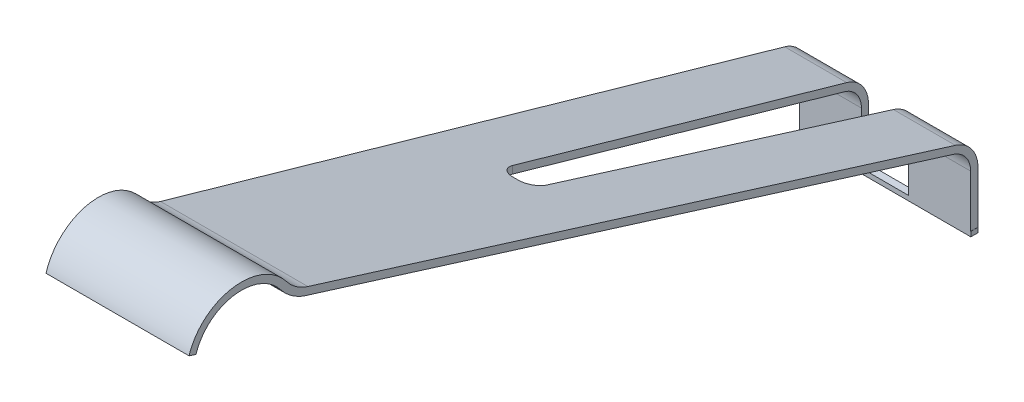
ISO-10303-21;
HEADER;
FILE_DESCRIPTION(('STEP AP214'),'2;1');
FILE_NAME('part.step','',(''),(''),'','','');
FILE_SCHEMA(('AUTOMOTIVE_DESIGN { 1 0 10303 214 1 1 1 1 }'));
ENDSEC;
DATA;
#1=APPLICATION_CONTEXT('core data for automotive mechanical design processes');
#2=APPLICATION_PROTOCOL_DEFINITION('international standard','automotive_design',2000,#1);
#3=PRODUCT_CONTEXT('',#1,'mechanical');
#4=PRODUCT('Part','Part','',(#3));
#5=PRODUCT_RELATED_PRODUCT_CATEGORY('part','',(#4));
#6=PRODUCT_DEFINITION_FORMATION('','',#4);
#7=PRODUCT_DEFINITION_CONTEXT('part definition',#1,'design');
#8=PRODUCT_DEFINITION('design','',#6,#7);
#9=PRODUCT_DEFINITION_SHAPE('','',#8);
#10=(LENGTH_UNIT() NAMED_UNIT(*) SI_UNIT(.MILLI.,.METRE.));
#11=(NAMED_UNIT(*) PLANE_ANGLE_UNIT() SI_UNIT($,.RADIAN.));
#12=(NAMED_UNIT(*) SI_UNIT($,.STERADIAN.) SOLID_ANGLE_UNIT());
#13=UNCERTAINTY_MEASURE_WITH_UNIT(LENGTH_MEASURE(1.E-05),#10,'distance_accuracy_value','');
#14=(GEOMETRIC_REPRESENTATION_CONTEXT(3) GLOBAL_UNCERTAINTY_ASSIGNED_CONTEXT((#13)) GLOBAL_UNIT_ASSIGNED_CONTEXT((#10,
#11,#12)) REPRESENTATION_CONTEXT('',''));
#15=CARTESIAN_POINT('',(0.,0.,0.));
#16=DIRECTION('',(0.,0.,1.));
#17=DIRECTION('',(1.,0.,0.));
#18=AXIS2_PLACEMENT_3D('',#15,#16,#17);
#19=CARTESIAN_POINT('',(1.05,10.25,9.45));
#20=DIRECTION('',(1.,0.,0.));
#21=DIRECTION('',(0.,0.,-1.));
#22=AXIS2_PLACEMENT_3D('',#19,#20,#21);
#23=CYLINDRICAL_SURFACE('',#22,1.15);
#24=DIRECTION('',(1.,0.,0.));
#25=VECTOR('',#24,1.);
#26=CARTESIAN_POINT('',(1.05,10.9468062298889,8.53514423104621));
#27=LINE('',#26,#25);
#28=CARTESIAN_POINT('',(1.3130467835805,10.9468062298889,8.53514423104621));
#29=VERTEX_POINT('',#28);
#30=CARTESIAN_POINT('',(4.38695321641951,10.9468062298889,8.53514423104621));
#31=VERTEX_POINT('',#30);
#32=EDGE_CURVE('E357',#29,#31,#27,.T.);
#33=ORIENTED_EDGE('',*,*,#32,.F.);
#34=CARTESIAN_POINT('',(1.32983418826821,10.25,9.45));
#35=DIRECTION('',(-0.999831685239239,0.,0.0183466942979514));
#36=DIRECTION('',(0.0183466942979514,0.,0.999831685239239));
#37=AXIS2_PLACEMENT_3D('',#34,#35,#36);
#38=ELLIPSE('',#37,1.1501935945597,1.15);
#39=CARTESIAN_POINT('',(1.35,10.5887784258786,10.5489673235175));
#40=VERTEX_POINT('',#39);
#41=EDGE_CURVE('E266',#29,#40,#38,.F.);
#42=ORIENTED_EDGE('',*,*,#41,.T.);
#43=DIRECTION('',(1.,0.,0.));
#44=VECTOR('',#43,1.);
#45=CARTESIAN_POINT('',(1.05,10.5887784258786,10.5489673235175));
#46=LINE('',#45,#44);
#47=CARTESIAN_POINT('',(4.35,10.5887784258786,10.5489673235175));
#48=VERTEX_POINT('',#47);
#49=EDGE_CURVE('E356',#40,#48,#46,.T.);
#50=ORIENTED_EDGE('',*,*,#49,.T.);
#51=CARTESIAN_POINT('',(4.37016581173179,10.25,9.45));
#52=DIRECTION('',(0.999831685239239,0.,0.0183466942979512));
#53=DIRECTION('',(0.0183466942979512,0.,-0.99983168523924));
#54=AXIS2_PLACEMENT_3D('',#51,#52,#53);
#55=ELLIPSE('',#54,1.1501935945597,1.15);
#56=EDGE_CURVE('E485',#48,#31,#55,.F.);
#57=ORIENTED_EDGE('',*,*,#56,.T.);
#58=EDGE_LOOP('',(#33,#42,#50,#57));
#59=FACE_BOUND('',#58,.T.);
#60=ADVANCED_FACE('F38',(#59),#23,.T.);
#61=CARTESIAN_POINT('',(1.05,11.4618369215459,7.85894648877603));
#62=DIRECTION('',(1.,0.,0.));
#63=DIRECTION('',(0.,0.,-1.));
#64=AXIS2_PLACEMENT_3D('',#61,#62,#63);
#65=CYLINDRICAL_SURFACE('',#64,0.849999999999999);
#66=DIRECTION('',(1.,0.,0.));
#67=VECTOR('',#66,1.);
#68=CARTESIAN_POINT('',(1.05,10.6473540340931,8.10208765362981));
#69=LINE('',#68,#67);
#70=CARTESIAN_POINT('',(1.30510028942866,10.6473540340931,8.10208765362981));
#71=VERTEX_POINT('',#70);
#72=CARTESIAN_POINT('',(4.39489971057135,10.6473540340931,8.10208765362981));
#73=VERTEX_POINT('',#72);
#74=EDGE_CURVE('E361',#71,#73,#69,.T.);
#75=ORIENTED_EDGE('',*,*,#74,.F.);
#76=CARTESIAN_POINT('',(1.30063870185479,11.4618369215459,7.85894648877603));
#77=DIRECTION('',(-0.999831685239239,0.,0.0183466942979514));
#78=DIRECTION('',(0.0183466942979514,0.,0.999831685239239));
#79=AXIS2_PLACEMENT_3D('',#76,#77,#78);
#80=ELLIPSE('',#79,0.850143091631079,0.849999999999999);
#81=EDGE_CURVE('E268',#71,#29,#80,.T.);
#82=ORIENTED_EDGE('',*,*,#81,.T.);
#83=ORIENTED_EDGE('',*,*,#32,.T.);
#84=CARTESIAN_POINT('',(4.39936129814521,11.4618369215459,7.85894648877603));
#85=DIRECTION('',(0.999831685239239,0.,0.0183466942979512));
#86=DIRECTION('',(0.0183466942979512,0.,-0.99983168523924));
#87=AXIS2_PLACEMENT_3D('',#84,#85,#86);
#88=ELLIPSE('',#87,0.850143091631079,0.849999999999999);
#89=EDGE_CURVE('E488',#31,#73,#88,.T.);
#90=ORIENTED_EDGE('',*,*,#89,.T.);
#91=EDGE_LOOP('',(#75,#82,#83,#90));
#92=FACE_BOUND('',#91,.T.);
#93=ADVANCED_FACE('F568',(#92),#65,.F.);
#94=CARTESIAN_POINT('',(1.05,6.66566017813856,-5.23593147900583));
#95=DIRECTION('',(0.,0.958215161709244,-0.286048429239748));
#96=DIRECTION('',(0.,0.286048429239748,0.958215161709244));
#97=AXIS2_PLACEMENT_3D('',#94,#95,#96);
#98=PLANE('',#97);
#99=DIRECTION('',(1.,0.,0.));
#100=VECTOR('',#99,1.);
#101=CARTESIAN_POINT('',(1.05,6.66566017813856,-5.23593147900583));
#102=LINE('',#101,#100);
#103=CARTESIAN_POINT('',(1.06035053486558,6.66566017813856,-5.23593147900583));
#104=VERTEX_POINT('',#103);
#105=CARTESIAN_POINT('',(2.36057628476864,6.66566017813856,-5.23593147900583));
#106=VERTEX_POINT('',#105);
#107=EDGE_CURVE('E365',#104,#106,#102,.T.);
#108=ORIENTED_EDGE('',*,*,#107,.F.);
#109=DIRECTION('',(0.0175803227434483,0.286004221651811,0.958067073565091));
#110=VECTOR('',#109,1.);
#111=CARTESIAN_POINT('',(1.06034733584908,6.66560813516772,-5.2361058143932));
#112=LINE('',#111,#110);
#113=EDGE_CURVE('E272',#104,#71,#112,.T.);
#114=ORIENTED_EDGE('',*,*,#113,.T.);
#115=ORIENTED_EDGE('',*,*,#74,.T.);
#116=DIRECTION('',(0.0175803227434481,-0.286004221651811,-0.958067073565091));
#117=VECTOR('',#116,1.);
#118=CARTESIAN_POINT('',(4.63854002025897,6.68370910264918,-5.17547055228588));
#119=LINE('',#118,#117);
#120=CARTESIAN_POINT('',(4.63964946513442,6.66566017813856,-5.23593147900583));
#121=VERTEX_POINT('',#120);
#122=EDGE_CURVE('E251',#73,#121,#119,.T.);
#123=ORIENTED_EDGE('',*,*,#122,.T.);
#124=CARTESIAN_POINT('',(3.33942371523136,6.66566017813856,-5.23593147900583));
#125=VERTEX_POINT('',#124);
#126=EDGE_CURVE('E366',#125,#121,#102,.T.);
#127=ORIENTED_EDGE('',*,*,#126,.F.);
#128=DIRECTION('',(-0.0179636352180036,0.286002272718787,0.958060544960204));
#129=VECTOR('',#128,1.);
#130=CARTESIAN_POINT('',(3.33868493607829,6.67742241413648,-5.19652992417554));
#131=LINE('',#130,#129);
#132=CARTESIAN_POINT('',(3.20551954978455,8.79757252102113,1.9056240114911));
#133=VERTEX_POINT('',#132);
#134=EDGE_CURVE('E323',#125,#133,#131,.T.);
#135=ORIENTED_EDGE('',*,*,#134,.T.);
#136=CARTESIAN_POINT('',(2.90557227025905,8.79589362914241,1.9));
#137=DIRECTION('',(0.,0.958215161709244,-0.286048429239748));
#138=DIRECTION('',(0.,-0.286048429239748,-0.958215161709244));
#139=AXIS2_PLACEMENT_3D('',#136,#137,#138);
#140=ELLIPSE('',#139,0.313082084262647,0.3);
#141=CARTESIAN_POINT('',(2.90557227025905,8.88545026756885,2.2));
#142=VERTEX_POINT('',#141);
#143=EDGE_CURVE('E327',#133,#142,#140,.F.);
#144=ORIENTED_EDGE('',*,*,#143,.T.);
#145=DIRECTION('',(-1.,0.,0.));
#146=VECTOR('',#145,1.);
#147=CARTESIAN_POINT('',(1.05,8.88545026756885,2.2));
#148=LINE('',#147,#146);
#149=CARTESIAN_POINT('',(2.79442772974096,8.88545026756885,2.2));
#150=VERTEX_POINT('',#149);
#151=EDGE_CURVE('E284',#142,#150,#148,.T.);
#152=ORIENTED_EDGE('',*,*,#151,.T.);
#153=CARTESIAN_POINT('',(2.79442772974096,8.79589362914241,1.9));
#154=DIRECTION('',(0.,0.958215161709244,-0.286048429239748));
#155=DIRECTION('',(0.,-0.286048429239748,-0.958215161709244));
#156=AXIS2_PLACEMENT_3D('',#153,#154,#155);
#157=ELLIPSE('',#156,0.313082084262647,0.3);
#158=CARTESIAN_POINT('',(2.49448045021546,8.79757252102113,1.9056240114911));
#159=VERTEX_POINT('',#158);
#160=EDGE_CURVE('E288',#150,#159,#157,.F.);
#161=ORIENTED_EDGE('',*,*,#160,.T.);
#162=DIRECTION('',(-0.0179636352180039,-0.286002272718787,-0.958060544960204));
#163=VECTOR('',#162,1.);
#164=CARTESIAN_POINT('',(2.36015337203683,6.65892690834137,-5.25848682470268));
#165=LINE('',#164,#163);
#166=EDGE_CURVE('E306',#159,#106,#165,.T.);
#167=ORIENTED_EDGE('',*,*,#166,.T.);
#168=EDGE_LOOP('',(#108,#114,#115,#123,#127,#135,#144,#152,#161,#167));
#169=FACE_BOUND('',#168,.T.);
#170=ADVANCED_FACE('F496',(#169),#98,.T.);
#171=CARTESIAN_POINT('',(1.05,6.04282032302755,-5.05));
#172=DIRECTION('',(1.,0.,0.));
#173=DIRECTION('',(0.,0.,-1.));
#174=AXIS2_PLACEMENT_3D('',#171,#172,#173);
#175=CYLINDRICAL_SURFACE('',#174,0.650000000000001);
#176=DIRECTION('',(1.,0.,0.));
#177=VECTOR('',#176,1.);
#178=CARTESIAN_POINT('',(1.05,6.04282032302755,-5.7));
#179=LINE('',#178,#177);
#180=CARTESIAN_POINT('',(1.05183497828373,6.04282032302755,-5.7));
#181=VERTEX_POINT('',#180);
#182=CARTESIAN_POINT('',(2.351875,6.04282032302755,-5.7));
#183=VERTEX_POINT('',#182);
#184=EDGE_CURVE('E370',#181,#183,#179,.T.);
#185=ORIENTED_EDGE('',*,*,#184,.F.);
#186=CARTESIAN_POINT('',(1.06376233712795,6.04282032302755,-5.05));
#187=DIRECTION('',(-0.999831685239239,0.,0.0183466942979514));
#188=DIRECTION('',(0.0183466942979514,0.,0.999831685239239));
#189=AXIS2_PLACEMENT_3D('',#186,#187,#188);
#190=ELLIPSE('',#189,0.650109423012003,0.650000000000001);
#191=EDGE_CURVE('E276',#181,#104,#190,.F.);
#192=ORIENTED_EDGE('',*,*,#191,.T.);
#193=ORIENTED_EDGE('',*,*,#107,.T.);
#194=CARTESIAN_POINT('',(2.3640625,6.04282032302755,-5.05));
#195=DIRECTION('',(0.999824265084997,0.,-0.0187467049703437));
#196=DIRECTION('',(0.0187467049703437,0.,0.999824265084997));
#197=AXIS2_PLACEMENT_3D('',#194,#195,#196);
#198=ELLIPSE('',#197,0.650114247772075,0.650000000000001);
#199=EDGE_CURVE('E302',#106,#183,#198,.F.);
#200=ORIENTED_EDGE('',*,*,#199,.T.);
#201=EDGE_LOOP('',(#185,#192,#193,#200));
#202=FACE_BOUND('',#201,.T.);
#203=ADVANCED_FACE('F545',(#202),#175,.T.);
#204=ORIENTED_EDGE('',*,*,#126,.T.);
#205=CARTESIAN_POINT('',(4.63623766287206,6.04282032302755,-5.05));
#206=DIRECTION('',(0.999831685239239,0.,0.0183466942979512));
#207=DIRECTION('',(0.0183466942979512,0.,-0.99983168523924));
#208=AXIS2_PLACEMENT_3D('',#205,#206,#207);
#209=ELLIPSE('',#208,0.650109423012003,0.650000000000001);
#210=CARTESIAN_POINT('',(4.64816502171628,6.04282032302755,-5.7));
#211=VERTEX_POINT('',#210);
#212=EDGE_CURVE('E243',#121,#211,#209,.F.);
#213=ORIENTED_EDGE('',*,*,#212,.T.);
#214=CARTESIAN_POINT('',(3.348125,6.04282032302755,-5.7));
#215=VERTEX_POINT('',#214);
#216=EDGE_CURVE('E240',#215,#211,#179,.T.);
#217=ORIENTED_EDGE('',*,*,#216,.F.);
#218=CARTESIAN_POINT('',(3.3359375,6.04282032302755,-5.05));
#219=DIRECTION('',(-0.999824265084997,0.,-0.0187467049703435));
#220=DIRECTION('',(0.0187467049703435,0.,-0.999824265084997));
#221=AXIS2_PLACEMENT_3D('',#218,#219,#220);
#222=ELLIPSE('',#221,0.650114247772075,0.650000000000001);
#223=EDGE_CURVE('E319',#215,#125,#222,.F.);
#224=ORIENTED_EDGE('',*,*,#223,.T.);
#225=EDGE_LOOP('',(#204,#213,#217,#224));
#226=FACE_BOUND('',#225,.T.);
#227=ADVANCED_FACE('F500',(#226),#175,.T.);
#228=CARTESIAN_POINT('',(1.05,4.85,-5.7));
#229=DIRECTION('',(0.,0.,-1.));
#230=DIRECTION('',(-1.,0.,0.));
#231=AXIS2_PLACEMENT_3D('',#228,#229,#230);
#232=PLANE('',#231);
#233=DIRECTION('',(1.,0.,0.));
#234=VECTOR('',#233,1.);
#235=CARTESIAN_POINT('',(1.05,4.95,-5.7));
#236=LINE('',#235,#234);
#237=CARTESIAN_POINT('',(1.05,4.95,-5.7));
#238=VERTEX_POINT('',#237);
#239=CARTESIAN_POINT('',(1.05183497828373,4.95,-5.7));
#240=VERTEX_POINT('',#239);
#241=EDGE_CURVE('E469',#238,#240,#236,.T.);
#242=ORIENTED_EDGE('',*,*,#241,.T.);
#243=DIRECTION('',(0.,1.,0.));
#244=VECTOR('',#243,1.);
#245=CARTESIAN_POINT('',(1.05183497828373,4.85,-5.7));
#246=LINE('',#245,#244);
#247=EDGE_CURVE('E280',#240,#181,#246,.T.);
#248=ORIENTED_EDGE('',*,*,#247,.T.);
#249=ORIENTED_EDGE('',*,*,#184,.T.);
#250=DIRECTION('',(0.,-1.,0.));
#251=VECTOR('',#250,1.);
#252=CARTESIAN_POINT('',(2.351875,4.85,-5.7));
#253=LINE('',#252,#251);
#254=CARTESIAN_POINT('',(2.351875,4.95,-5.7));
#255=VERTEX_POINT('',#254);
#256=EDGE_CURVE('E298',#183,#255,#253,.T.);
#257=ORIENTED_EDGE('',*,*,#256,.T.);
#258=DIRECTION('',(1.,0.,0.));
#259=VECTOR('',#258,1.);
#260=CARTESIAN_POINT('',(1.05,4.95,-5.7));
#261=LINE('',#260,#259);
#262=CARTESIAN_POINT('',(3.348125,4.95,-5.7));
#263=VERTEX_POINT('',#262);
#264=EDGE_CURVE('E331',#255,#263,#261,.T.);
#265=ORIENTED_EDGE('',*,*,#264,.T.);
#266=DIRECTION('',(0.,1.,0.));
#267=VECTOR('',#266,1.);
#268=CARTESIAN_POINT('',(3.348125,4.85,-5.7));
#269=LINE('',#268,#267);
#270=EDGE_CURVE('E316',#263,#215,#269,.T.);
#271=ORIENTED_EDGE('',*,*,#270,.T.);
#272=ORIENTED_EDGE('',*,*,#216,.T.);
#273=DIRECTION('',(0.,-1.,0.));
#274=VECTOR('',#273,1.);
#275=CARTESIAN_POINT('',(4.64816502171628,4.85,-5.7));
#276=LINE('',#275,#274);
#277=CARTESIAN_POINT('',(4.64816502171628,4.95,-5.7));
#278=VERTEX_POINT('',#277);
#279=EDGE_CURVE('E227',#211,#278,#276,.T.);
#280=ORIENTED_EDGE('',*,*,#279,.T.);
#281=DIRECTION('',(1.,0.,0.));
#282=VECTOR('',#281,1.);
#283=CARTESIAN_POINT('',(1.05,4.95,-5.7));
#284=LINE('',#283,#282);
#285=CARTESIAN_POINT('',(4.65,4.95,-5.7));
#286=VERTEX_POINT('',#285);
#287=EDGE_CURVE('E210',#278,#286,#284,.T.);
#288=ORIENTED_EDGE('',*,*,#287,.T.);
#289=DIRECTION('',(0.,1.,0.));
#290=VECTOR('',#289,1.);
#291=CARTESIAN_POINT('',(4.65,4.85,-5.7));
#292=LINE('',#291,#290);
#293=CARTESIAN_POINT('',(4.65,4.85,-5.7));
#294=VERTEX_POINT('',#293);
#295=EDGE_CURVE('E343',#294,#286,#292,.T.);
#296=ORIENTED_EDGE('',*,*,#295,.F.);
#297=DIRECTION('',(1.,0.,0.));
#298=VECTOR('',#297,1.);
#299=CARTESIAN_POINT('',(1.05,4.85,-5.7));
#300=LINE('',#299,#298);
#301=CARTESIAN_POINT('',(1.05,4.85,-5.7));
#302=VERTEX_POINT('',#301);
#303=EDGE_CURVE('E373',#302,#294,#300,.T.);
#304=ORIENTED_EDGE('',*,*,#303,.F.);
#305=DIRECTION('',(0.,1.,0.));
#306=VECTOR('',#305,1.);
#307=CARTESIAN_POINT('',(1.05,4.85,-5.7));
#308=LINE('',#307,#306);
#309=EDGE_CURVE('E352',#302,#238,#308,.T.);
#310=ORIENTED_EDGE('',*,*,#309,.T.);
#311=EDGE_LOOP('',(#242,#248,#249,#257,#265,#271,#272,#280,#288,#296,#304,#310));
#312=FACE_BOUND('',#311,.T.);
#313=ADVANCED_FACE('F237',(#312),#232,.T.);
#314=CARTESIAN_POINT('',(1.05,4.85,-5.55));
#315=DIRECTION('',(0.,0.,-1.));
#316=DIRECTION('',(-1.,0.,0.));
#317=AXIS2_PLACEMENT_3D('',#314,#315,#316);
#318=PLANE('',#317);
#319=DIRECTION('',(0.,1.,0.));
#320=VECTOR('',#319,1.);
#321=CARTESIAN_POINT('',(1.05458744570932,4.85,-5.55));
#322=LINE('',#321,#320);
#323=CARTESIAN_POINT('',(1.05458744570932,4.95,-5.55));
#324=VERTEX_POINT('',#323);
#325=CARTESIAN_POINT('',(1.05458744570932,6.04282032302755,-5.55));
#326=VERTEX_POINT('',#325);
#327=EDGE_CURVE('E263',#324,#326,#322,.T.);
#328=ORIENTED_EDGE('',*,*,#327,.F.);
#329=DIRECTION('',(1.,0.,0.));
#330=VECTOR('',#329,1.);
#331=CARTESIAN_POINT('',(1.05,4.95,-5.55));
#332=LINE('',#331,#330);
#333=CARTESIAN_POINT('',(1.05,4.95,-5.55));
#334=VERTEX_POINT('',#333);
#335=EDGE_CURVE('E222',#334,#324,#332,.T.);
#336=ORIENTED_EDGE('',*,*,#335,.F.);
#337=DIRECTION('',(0.,1.,0.));
#338=VECTOR('',#337,1.);
#339=CARTESIAN_POINT('',(1.05,4.85,-5.55));
#340=LINE('',#339,#338);
#341=CARTESIAN_POINT('',(1.05,4.85,-5.55));
#342=VERTEX_POINT('',#341);
#343=EDGE_CURVE('E346',#342,#334,#340,.T.);
#344=ORIENTED_EDGE('',*,*,#343,.F.);
#345=DIRECTION('',(1.,0.,0.));
#346=VECTOR('',#345,1.);
#347=CARTESIAN_POINT('',(1.05,4.85,-5.55));
#348=LINE('',#347,#346);
#349=CARTESIAN_POINT('',(4.65,4.85,-5.55));
#350=VERTEX_POINT('',#349);
#351=EDGE_CURVE('E376',#342,#350,#348,.T.);
#352=ORIENTED_EDGE('',*,*,#351,.T.);
#353=DIRECTION('',(0.,1.,0.));
#354=VECTOR('',#353,1.);
#355=CARTESIAN_POINT('',(4.65,4.85,-5.55));
#356=LINE('',#355,#354);
#357=CARTESIAN_POINT('',(4.65,4.95,-5.55));
#358=VERTEX_POINT('',#357);
#359=EDGE_CURVE('E335',#350,#358,#356,.T.);
#360=ORIENTED_EDGE('',*,*,#359,.T.);
#361=DIRECTION('',(1.,0.,0.));
#362=VECTOR('',#361,1.);
#363=CARTESIAN_POINT('',(1.05,4.95,-5.55));
#364=LINE('',#363,#362);
#365=CARTESIAN_POINT('',(4.64541255429069,4.95,-5.55));
#366=VERTEX_POINT('',#365);
#367=EDGE_CURVE('E223',#366,#358,#364,.T.);
#368=ORIENTED_EDGE('',*,*,#367,.F.);
#369=DIRECTION('',(0.,-1.,0.));
#370=VECTOR('',#369,1.);
#371=CARTESIAN_POINT('',(4.64541255429069,4.85,-5.55));
#372=LINE('',#371,#370);
#373=CARTESIAN_POINT('',(4.64541255429069,6.04282032302755,-5.55));
#374=VERTEX_POINT('',#373);
#375=EDGE_CURVE('E230',#374,#366,#372,.T.);
#376=ORIENTED_EDGE('',*,*,#375,.F.);
#377=DIRECTION('',(1.,0.,0.));
#378=VECTOR('',#377,1.);
#379=CARTESIAN_POINT('',(1.05,6.04282032302755,-5.55));
#380=LINE('',#379,#378);
#381=CARTESIAN_POINT('',(3.3453125,6.04282032302755,-5.55));
#382=VERTEX_POINT('',#381);
#383=EDGE_CURVE('E380',#382,#374,#380,.T.);
#384=ORIENTED_EDGE('',*,*,#383,.F.);
#385=DIRECTION('',(0.,1.,0.));
#386=VECTOR('',#385,1.);
#387=CARTESIAN_POINT('',(3.3453125,4.85,-5.55));
#388=LINE('',#387,#386);
#389=CARTESIAN_POINT('',(3.3453125,4.95,-5.55));
#390=VERTEX_POINT('',#389);
#391=EDGE_CURVE('E313',#390,#382,#388,.T.);
#392=ORIENTED_EDGE('',*,*,#391,.F.);
#393=DIRECTION('',(1.,0.,0.));
#394=VECTOR('',#393,1.);
#395=CARTESIAN_POINT('',(1.05,4.95,-5.55));
#396=LINE('',#395,#394);
#397=CARTESIAN_POINT('',(2.3546875,4.95,-5.55));
#398=VERTEX_POINT('',#397);
#399=EDGE_CURVE('E11',#398,#390,#396,.T.);
#400=ORIENTED_EDGE('',*,*,#399,.F.);
#401=DIRECTION('',(0.,-1.,0.));
#402=VECTOR('',#401,1.);
#403=CARTESIAN_POINT('',(2.3546875,4.85,-5.55));
#404=LINE('',#403,#402);
#405=CARTESIAN_POINT('',(2.3546875,6.04282032302755,-5.55));
#406=VERTEX_POINT('',#405);
#407=EDGE_CURVE('E295',#406,#398,#404,.T.);
#408=ORIENTED_EDGE('',*,*,#407,.F.);
#409=EDGE_CURVE('E379',#326,#406,#380,.T.);
#410=ORIENTED_EDGE('',*,*,#409,.F.);
#411=EDGE_LOOP('',(#328,#336,#344,#352,#360,#368,#376,#384,#392,#400,#408,#410));
#412=FACE_BOUND('',#411,.T.);
#413=ADVANCED_FACE('F531',(#412),#318,.F.);
#414=CARTESIAN_POINT('',(1.05,6.04282032302755,-5.05));
#415=DIRECTION('',(1.,0.,0.));
#416=DIRECTION('',(0.,0.,-1.));
#417=AXIS2_PLACEMENT_3D('',#414,#415,#416);
#418=CYLINDRICAL_SURFACE('',#417,0.500000000000001);
#419=CARTESIAN_POINT('',(1.06376233712795,6.04282032302755,-5.05));
#420=DIRECTION('',(-0.999831685239239,0.,0.0183466942979514));
#421=DIRECTION('',(0.0183466942979514,0.,0.999831685239239));
#422=AXIS2_PLACEMENT_3D('',#419,#420,#421);
#423=ELLIPSE('',#422,0.500084171547695,0.500000000000001);
#424=CARTESIAN_POINT('',(1.0611378738492,6.52192790388217,-5.19302421461987));
#425=VERTEX_POINT('',#424);
#426=EDGE_CURVE('E260',#326,#425,#423,.F.);
#427=ORIENTED_EDGE('',*,*,#426,.F.);
#428=ORIENTED_EDGE('',*,*,#409,.T.);
#429=CARTESIAN_POINT('',(2.3640625,6.04282032302755,-5.05));
#430=DIRECTION('',(0.999824265084997,0.,-0.0187467049703437));
#431=DIRECTION('',(0.0187467049703437,0.,0.999824265084997));
#432=AXIS2_PLACEMENT_3D('',#429,#430,#431);
#433=ELLIPSE('',#432,0.500087882901596,0.500000000000001);
#434=CARTESIAN_POINT('',(2.36138079597588,6.52192790388217,-5.19302421461987));
#435=VERTEX_POINT('',#434);
#436=EDGE_CURVE('E292',#435,#406,#433,.F.);
#437=ORIENTED_EDGE('',*,*,#436,.F.);
#438=DIRECTION('',(1.,0.,0.));
#439=VECTOR('',#438,1.);
#440=CARTESIAN_POINT('',(1.05,6.52192790388217,-5.19302421461987));
#441=LINE('',#440,#439);
#442=EDGE_CURVE('E384',#425,#435,#441,.T.);
#443=ORIENTED_EDGE('',*,*,#442,.F.);
#444=EDGE_LOOP('',(#427,#428,#437,#443));
#445=FACE_BOUND('',#444,.T.);
#446=ADVANCED_FACE('F538',(#445),#418,.F.);
#447=CARTESIAN_POINT('',(4.63623766287206,6.04282032302755,-5.05));
#448=DIRECTION('',(0.999831685239239,0.,0.0183466942979512));
#449=DIRECTION('',(0.0183466942979512,0.,-0.99983168523924));
#450=AXIS2_PLACEMENT_3D('',#447,#448,#449);
#451=ELLIPSE('',#450,0.500084171547695,0.500000000000001);
#452=CARTESIAN_POINT('',(4.6388621261508,6.52192790388217,-5.19302421461987));
#453=VERTEX_POINT('',#452);
#454=EDGE_CURVE('E480',#453,#374,#451,.F.);
#455=ORIENTED_EDGE('',*,*,#454,.F.);
#456=CARTESIAN_POINT('',(3.33861920402413,6.52192790388217,-5.19302421461987));
#457=VERTEX_POINT('',#456);
#458=EDGE_CURVE('E385',#457,#453,#441,.T.);
#459=ORIENTED_EDGE('',*,*,#458,.F.);
#460=CARTESIAN_POINT('',(3.3359375,6.04282032302755,-5.05));
#461=DIRECTION('',(-0.999824265084997,0.,-0.0187467049703435));
#462=DIRECTION('',(0.0187467049703435,0.,-0.999824265084997));
#463=AXIS2_PLACEMENT_3D('',#460,#461,#462);
#464=ELLIPSE('',#463,0.500087882901596,0.500000000000001);
#465=EDGE_CURVE('E310',#382,#457,#464,.F.);
#466=ORIENTED_EDGE('',*,*,#465,.F.);
#467=ORIENTED_EDGE('',*,*,#383,.T.);
#468=EDGE_LOOP('',(#455,#459,#466,#467));
#469=FACE_BOUND('',#468,.T.);
#470=ADVANCED_FACE('F550',(#469),#418,.F.);
#471=CARTESIAN_POINT('',(1.05,6.52192790388217,-5.19302421461987));
#472=DIRECTION('',(0.,0.958215161709244,-0.286048429239748));
#473=DIRECTION('',(0.,0.286048429239748,0.958215161709244));
#474=AXIS2_PLACEMENT_3D('',#471,#472,#473);
#475=PLANE('',#474);
#476=DIRECTION('',(0.0175803227434483,0.286004221651811,0.958067073565091));
#477=VECTOR('',#476,1.);
#478=CARTESIAN_POINT('',(1.06113443149162,6.5218719021343,-5.19321181125881));
#479=LINE('',#478,#477);
#480=CARTESIAN_POINT('',(1.30588762841228,10.5036217598367,8.14499491801577));
#481=VERTEX_POINT('',#480);
#482=EDGE_CURVE('E257',#425,#481,#479,.T.);
#483=ORIENTED_EDGE('',*,*,#482,.F.);
#484=ORIENTED_EDGE('',*,*,#442,.T.);
#485=DIRECTION('',(-0.0179636352180039,-0.286002272718787,-0.958060544960204));
#486=VECTOR('',#485,1.);
#487=CARTESIAN_POINT('',(2.36095762363458,6.51519050079563,-5.21559340615584));
#488=LINE('',#487,#486);
#489=CARTESIAN_POINT('',(2.49448045021546,8.6410314788898,1.9056240114911));
#490=VERTEX_POINT('',#489);
#491=EDGE_CURVE('E422',#490,#435,#488,.T.);
#492=ORIENTED_EDGE('',*,*,#491,.F.);
#493=CARTESIAN_POINT('',(2.79442772974096,8.63935258701109,1.9));
#494=DIRECTION('',(0.,0.958215161709244,-0.286048429239748));
#495=DIRECTION('',(0.,-0.286048429239748,-0.958215161709244));
#496=AXIS2_PLACEMENT_3D('',#493,#494,#495);
#497=ELLIPSE('',#496,0.313082084262647,0.3);
#498=CARTESIAN_POINT('',(2.79442772974096,8.72890922543752,2.2));
#499=VERTEX_POINT('',#498);
#500=EDGE_CURVE('E419',#499,#490,#497,.F.);
#501=ORIENTED_EDGE('',*,*,#500,.F.);
#502=DIRECTION('',(-1.,0.,0.));
#503=VECTOR('',#502,1.);
#504=CARTESIAN_POINT('',(1.05,8.72890922543752,2.2));
#505=LINE('',#504,#503);
#506=CARTESIAN_POINT('',(2.90557227025905,8.72890922543752,2.2));
#507=VERTEX_POINT('',#506);
#508=EDGE_CURVE('E416',#507,#499,#505,.T.);
#509=ORIENTED_EDGE('',*,*,#508,.F.);
#510=CARTESIAN_POINT('',(2.90557227025905,8.63935258701109,1.9));
#511=DIRECTION('',(0.,0.958215161709244,-0.286048429239748));
#512=DIRECTION('',(0.,-0.286048429239748,-0.958215161709244));
#513=AXIS2_PLACEMENT_3D('',#510,#511,#512);
#514=ELLIPSE('',#513,0.313082084262647,0.3);
#515=CARTESIAN_POINT('',(3.20551954978455,8.6410314788898,1.9056240114911));
#516=VERTEX_POINT('',#515);
#517=EDGE_CURVE('E425',#516,#507,#514,.F.);
#518=ORIENTED_EDGE('',*,*,#517,.F.);
#519=DIRECTION('',(-0.0179636352180036,0.286002272718787,0.958060544960204));
#520=VECTOR('',#519,1.);
#521=CARTESIAN_POINT('',(3.33788068448054,6.53368600659073,-5.1536365056287));
#522=LINE('',#521,#520);
#523=EDGE_CURVE('E46',#457,#516,#522,.T.);
#524=ORIENTED_EDGE('',*,*,#523,.F.);
#525=ORIENTED_EDGE('',*,*,#458,.T.);
#526=DIRECTION('',(0.0175803227434481,-0.286004221651811,-0.958067073565091));
#527=VECTOR('',#526,1.);
#528=CARTESIAN_POINT('',(4.63775292461644,6.53997286961576,-5.13257654915149));
#529=LINE('',#528,#527);
#530=CARTESIAN_POINT('',(4.39411237158773,10.5036217598367,8.14499491801577));
#531=VERTEX_POINT('',#530);
#532=EDGE_CURVE('E477',#531,#453,#529,.T.);
#533=ORIENTED_EDGE('',*,*,#532,.F.);
#534=DIRECTION('',(1.,0.,0.));
#535=VECTOR('',#534,1.);
#536=CARTESIAN_POINT('',(1.05,10.5036217598367,8.14499491801577));
#537=LINE('',#536,#535);
#538=EDGE_CURVE('E389',#481,#531,#537,.T.);
#539=ORIENTED_EDGE('',*,*,#538,.F.);
#540=EDGE_LOOP('',(#483,#484,#492,#501,#509,#518,#524,#525,#533,#539));
#541=FACE_BOUND('',#540,.T.);
#542=ADVANCED_FACE('F444',(#541),#475,.F.);
#543=CARTESIAN_POINT('',(1.05,11.4618369215459,7.85894648877603));
#544=DIRECTION('',(1.,0.,0.));
#545=DIRECTION('',(0.,0.,-1.));
#546=AXIS2_PLACEMENT_3D('',#543,#544,#545);
#547=CYLINDRICAL_SURFACE('',#546,0.999999999999999);
#548=CARTESIAN_POINT('',(1.30063870185479,11.4618369215459,7.85894648877603));
#549=DIRECTION('',(-0.999831685239239,0.,0.0183466942979514));
#550=DIRECTION('',(0.0183466942979514,0.,0.999831685239239));
#551=AXIS2_PLACEMENT_3D('',#548,#549,#550);
#552=ELLIPSE('',#551,1.00016834309539,0.999999999999999);
#553=CARTESIAN_POINT('',(1.3152364450615,10.855918460773,8.65447324438801));
#554=VERTEX_POINT('',#553);
#555=EDGE_CURVE('E248',#481,#554,#552,.T.);
#556=ORIENTED_EDGE('',*,*,#555,.F.);
#557=ORIENTED_EDGE('',*,*,#538,.T.);
#558=CARTESIAN_POINT('',(4.39936129814521,11.4618369215459,7.85894648877603));
#559=DIRECTION('',(0.999831685239239,0.,0.0183466942979512));
#560=DIRECTION('',(0.0183466942979512,0.,-0.99983168523924));
#561=AXIS2_PLACEMENT_3D('',#558,#559,#560);
#562=ELLIPSE('',#561,1.00016834309539,0.999999999999999);
#563=CARTESIAN_POINT('',(4.3847635549385,10.855918460773,8.65447324438801));
#564=VERTEX_POINT('',#563);
#565=EDGE_CURVE('E474',#564,#531,#562,.T.);
#566=ORIENTED_EDGE('',*,*,#565,.F.);
#567=DIRECTION('',(1.,0.,0.));
#568=VECTOR('',#567,1.);
#569=CARTESIAN_POINT('',(1.05,10.855918460773,8.65447324438801));
#570=LINE('',#569,#568);
#571=EDGE_CURVE('E393',#554,#564,#570,.T.);
#572=ORIENTED_EDGE('',*,*,#571,.F.);
#573=EDGE_LOOP('',(#556,#557,#566,#572));
#574=FACE_BOUND('',#573,.T.);
#575=ADVANCED_FACE('F590',(#574),#547,.T.);
#576=CARTESIAN_POINT('',(1.05,10.25,9.45));
#577=DIRECTION('',(1.,0.,0.));
#578=DIRECTION('',(0.,0.,-1.));
#579=AXIS2_PLACEMENT_3D('',#576,#577,#578);
#580=CYLINDRICAL_SURFACE('',#579,0.999999999999999);
#581=CARTESIAN_POINT('',(1.32983418826821,10.25,9.45));
#582=DIRECTION('',(-0.999831685239239,0.,0.0183466942979514));
#583=DIRECTION('',(0.0183466942979514,0.,0.999831685239239));
#584=AXIS2_PLACEMENT_3D('',#581,#582,#583);
#585=ELLIPSE('',#584,1.00016834309539,0.999999999999999);
#586=CARTESIAN_POINT('',(1.34736967673064,10.5445899355466,10.4056237595804));
#587=VERTEX_POINT('',#586);
#588=EDGE_CURVE('E242',#554,#587,#585,.F.);
#589=ORIENTED_EDGE('',*,*,#588,.F.);
#590=ORIENTED_EDGE('',*,*,#571,.T.);
#591=CARTESIAN_POINT('',(4.37016581173179,10.25,9.45));
#592=DIRECTION('',(0.999831685239239,0.,0.0183466942979512));
#593=DIRECTION('',(0.0183466942979512,0.,-0.99983168523924));
#594=AXIS2_PLACEMENT_3D('',#591,#592,#593);
#595=ELLIPSE('',#594,1.00016834309539,0.999999999999999);
#596=CARTESIAN_POINT('',(4.35263032326937,10.5445899355466,10.4056237595804));
#597=VERTEX_POINT('',#596);
#598=EDGE_CURVE('E472',#597,#564,#595,.F.);
#599=ORIENTED_EDGE('',*,*,#598,.F.);
#600=DIRECTION('',(1.,0.,0.));
#601=VECTOR('',#600,1.);
#602=CARTESIAN_POINT('',(1.05,10.5445899355466,10.4056237595804));
#603=LINE('',#602,#601);
#604=EDGE_CURVE('E397',#587,#597,#603,.T.);
#605=ORIENTED_EDGE('',*,*,#604,.F.);
#606=EDGE_LOOP('',(#589,#590,#599,#605));
#607=FACE_BOUND('',#606,.T.);
#608=ADVANCED_FACE('F586',(#607),#580,.F.);
#609=CARTESIAN_POINT('',(1.05,10.5445899355466,10.4056237595804));
#610=DIRECTION('',(0.,0.955623759580447,-0.294589935546569));
#611=DIRECTION('',(0.,0.294589935546569,0.955623759580447));
#612=AXIS2_PLACEMENT_3D('',#609,#610,#611);
#613=PLANE('',#612);
#614=DIRECTION('',(0.0175327930609296,0.294544653765281,0.955476869477107));
#615=VECTOR('',#614,1.);
#616=CARTESIAN_POINT('',(1.34727826563919,10.5430542618984,10.4006421697565));
#617=LINE('',#616,#615);
#618=EDGE_CURVE('E412',#587,#40,#617,.T.);
#619=ORIENTED_EDGE('',*,*,#618,.F.);
#620=ORIENTED_EDGE('',*,*,#604,.T.);
#621=DIRECTION('',(0.0175327930609294,-0.294544653765281,-0.955476869477107));
#622=VECTOR('',#621,1.);
#623=CARTESIAN_POINT('',(4.35161509856376,10.5616453475604,10.4609500113739));
#624=LINE('',#623,#622);
#625=EDGE_CURVE('E409',#48,#597,#624,.T.);
#626=ORIENTED_EDGE('',*,*,#625,.F.);
#627=ORIENTED_EDGE('',*,*,#49,.F.);
#628=EDGE_LOOP('',(#619,#620,#626,#627));
#629=FACE_BOUND('',#628,.T.);
#630=ADVANCED_FACE('F582',(#629),#613,.F.);
#631=CARTESIAN_POINT('',(1.05,10.25,9.45));
#632=DIRECTION('',(1.,0.,0.));
#633=DIRECTION('',(0.,0.,-1.));
#634=AXIS2_PLACEMENT_3D('',#631,#632,#633);
#635=PLANE('',#634);
#636=DIRECTION('',(0.,0.,1.));
#637=VECTOR('',#636,1.);
#638=CARTESIAN_POINT('',(1.05,4.95,9.45));
#639=LINE('',#638,#637);
#640=EDGE_CURVE('E406',#238,#334,#639,.T.);
#641=ORIENTED_EDGE('',*,*,#640,.F.);
#642=ORIENTED_EDGE('',*,*,#309,.F.);
#643=DIRECTION('',(0.,0.,1.));
#644=VECTOR('',#643,1.);
#645=CARTESIAN_POINT('',(1.05,4.85,-5.7));
#646=LINE('',#645,#644);
#647=EDGE_CURVE('E349',#302,#342,#646,.T.);
#648=ORIENTED_EDGE('',*,*,#647,.T.);
#649=ORIENTED_EDGE('',*,*,#343,.T.);
#650=EDGE_LOOP('',(#641,#642,#648,#649));
#651=FACE_BOUND('',#650,.T.);
#652=ADVANCED_FACE('F527',(#651),#635,.F.);
#653=CARTESIAN_POINT('',(4.65,10.25,9.45));
#654=DIRECTION('',(1.,0.,0.));
#655=DIRECTION('',(0.,0.,-1.));
#656=AXIS2_PLACEMENT_3D('',#653,#654,#655);
#657=PLANE('',#656);
#658=ORIENTED_EDGE('',*,*,#295,.T.);
#659=DIRECTION('',(0.,0.,1.));
#660=VECTOR('',#659,1.);
#661=CARTESIAN_POINT('',(4.65,4.95,9.45));
#662=LINE('',#661,#660);
#663=EDGE_CURVE('E216',#286,#358,#662,.T.);
#664=ORIENTED_EDGE('',*,*,#663,.T.);
#665=ORIENTED_EDGE('',*,*,#359,.F.);
#666=DIRECTION('',(0.,0.,1.));
#667=VECTOR('',#666,1.);
#668=CARTESIAN_POINT('',(4.65,4.85,-5.7));
#669=LINE('',#668,#667);
#670=EDGE_CURVE('E339',#294,#350,#669,.T.);
#671=ORIENTED_EDGE('',*,*,#670,.F.);
#672=EDGE_LOOP('',(#658,#664,#665,#671));
#673=FACE_BOUND('',#672,.T.);
#674=ADVANCED_FACE('F553',(#673),#657,.T.);
#675=CARTESIAN_POINT('',(1.05,4.85,-5.7));
#676=DIRECTION('',(0.,1.,0.));
#677=DIRECTION('',(0.,0.,1.));
#678=AXIS2_PLACEMENT_3D('',#675,#676,#677);
#679=PLANE('',#678);
#680=ORIENTED_EDGE('',*,*,#303,.T.);
#681=ORIENTED_EDGE('',*,*,#670,.T.);
#682=ORIENTED_EDGE('',*,*,#351,.F.);
#683=ORIENTED_EDGE('',*,*,#647,.F.);
#684=EDGE_LOOP('',(#680,#681,#682,#683));
#685=FACE_BOUND('',#684,.T.);
#686=ADVANCED_FACE('F556',(#685),#679,.F.);
#687=CARTESIAN_POINT('',(4.65,11.4,-5.8));
#688=DIRECTION('',(0.999831685239239,0.,0.0183466942979512));
#689=DIRECTION('',(0.0183466942979512,0.,-0.99983168523924));
#690=AXIS2_PLACEMENT_3D('',#687,#688,#689);
#691=PLANE('',#690);
#692=ORIENTED_EDGE('',*,*,#212,.F.);
#693=ORIENTED_EDGE('',*,*,#122,.F.);
#694=ORIENTED_EDGE('',*,*,#89,.F.);
#695=ORIENTED_EDGE('',*,*,#56,.F.);
#696=ORIENTED_EDGE('',*,*,#625,.T.);
#697=ORIENTED_EDGE('',*,*,#598,.T.);
#698=ORIENTED_EDGE('',*,*,#565,.T.);
#699=ORIENTED_EDGE('',*,*,#532,.T.);
#700=ORIENTED_EDGE('',*,*,#454,.T.);
#701=ORIENTED_EDGE('',*,*,#375,.T.);
#702=DIRECTION('',(-0.0183466942979512,0.,0.999831685239239));
#703=VECTOR('',#702,1.);
#704=CARTESIAN_POINT('',(4.65,4.95,-5.8));
#705=LINE('',#704,#703);
#706=EDGE_CURVE('E213',#278,#366,#705,.T.);
#707=ORIENTED_EDGE('',*,*,#706,.F.);
#708=ORIENTED_EDGE('',*,*,#279,.F.);
#709=EDGE_LOOP('',(#692,#693,#694,#695,#696,#697,#698,#699,#700,#701,#707,#708));
#710=FACE_BOUND('',#709,.T.);
#711=ADVANCED_FACE('F226',(#710),#691,.T.);
#712=CARTESIAN_POINT('',(0.,4.95,0.));
#713=DIRECTION('',(0.,1.,0.));
#714=DIRECTION('',(0.,0.,1.));
#715=AXIS2_PLACEMENT_3D('',#712,#713,#714);
#716=PLANE('',#715);
#717=ORIENTED_EDGE('',*,*,#706,.T.);
#718=ORIENTED_EDGE('',*,*,#367,.T.);
#719=ORIENTED_EDGE('',*,*,#663,.F.);
#720=ORIENTED_EDGE('',*,*,#287,.F.);
#721=EDGE_LOOP('',(#717,#718,#719,#720));
#722=FACE_BOUND('',#721,.T.);
#723=ADVANCED_FACE('F212',(#722),#716,.T.);
#724=CARTESIAN_POINT('',(1.05,11.4,-5.8));
#725=DIRECTION('',(-0.999831685239239,0.,0.0183466942979514));
#726=DIRECTION('',(0.0183466942979514,0.,0.99983168523924));
#727=AXIS2_PLACEMENT_3D('',#724,#725,#726);
#728=PLANE('',#727);
#729=DIRECTION('',(-0.0183466942979514,0.,-0.999831685239239));
#730=VECTOR('',#729,1.);
#731=CARTESIAN_POINT('',(1.05,4.95,-5.8));
#732=LINE('',#731,#730);
#733=EDGE_CURVE('E232',#324,#240,#732,.T.);
#734=ORIENTED_EDGE('',*,*,#733,.F.);
#735=ORIENTED_EDGE('',*,*,#327,.T.);
#736=ORIENTED_EDGE('',*,*,#426,.T.);
#737=ORIENTED_EDGE('',*,*,#482,.T.);
#738=ORIENTED_EDGE('',*,*,#555,.T.);
#739=ORIENTED_EDGE('',*,*,#588,.T.);
#740=ORIENTED_EDGE('',*,*,#618,.T.);
#741=ORIENTED_EDGE('',*,*,#41,.F.);
#742=ORIENTED_EDGE('',*,*,#81,.F.);
#743=ORIENTED_EDGE('',*,*,#113,.F.);
#744=ORIENTED_EDGE('',*,*,#191,.F.);
#745=ORIENTED_EDGE('',*,*,#247,.F.);
#746=EDGE_LOOP('',(#734,#735,#736,#737,#738,#739,#740,#741,#742,#743,#744,#745));
#747=FACE_BOUND('',#746,.T.);
#748=ADVANCED_FACE('F535',(#747),#728,.T.);
#749=CARTESIAN_POINT('',(0.,4.95,0.));
#750=DIRECTION('',(0.,1.,0.));
#751=DIRECTION('',(0.,0.,1.));
#752=AXIS2_PLACEMENT_3D('',#749,#750,#751);
#753=PLANE('',#752);
#754=ORIENTED_EDGE('',*,*,#640,.T.);
#755=ORIENTED_EDGE('',*,*,#335,.T.);
#756=ORIENTED_EDGE('',*,*,#733,.T.);
#757=ORIENTED_EDGE('',*,*,#241,.F.);
#758=EDGE_LOOP('',(#754,#755,#756,#757));
#759=FACE_BOUND('',#758,.T.);
#760=ADVANCED_FACE('F518',(#759),#753,.T.);
#761=CARTESIAN_POINT('',(2.90557227025905,4.95,1.9));
#762=DIRECTION('',(0.,1.,0.));
#763=DIRECTION('',(0.,0.,1.));
#764=AXIS2_PLACEMENT_3D('',#761,#762,#763);
#765=PLANE('',#764);
#766=DIRECTION('',(0.0187467049703437,0.,0.999824265084997));
#767=VECTOR('',#766,1.);
#768=CARTESIAN_POINT('',(2.49448045021546,4.95,1.9056240114911));
#769=LINE('',#768,#767);
#770=EDGE_CURVE('E461',#255,#398,#769,.T.);
#771=ORIENTED_EDGE('',*,*,#770,.T.);
#772=ORIENTED_EDGE('',*,*,#399,.T.);
#773=DIRECTION('',(0.0187467049703435,0.,-0.999824265084997));
#774=VECTOR('',#773,1.);
#775=CARTESIAN_POINT('',(3.20551954978455,4.95,1.9056240114911));
#776=LINE('',#775,#774);
#777=EDGE_CURVE('E52',#390,#263,#776,.T.);
#778=ORIENTED_EDGE('',*,*,#777,.T.);
#779=ORIENTED_EDGE('',*,*,#264,.F.);
#780=EDGE_LOOP('',(#771,#772,#778,#779));
#781=FACE_BOUND('',#780,.T.);
#782=ADVANCED_FACE('F504',(#781),#765,.T.);
#783=CARTESIAN_POINT('',(2.90557227025905,11.4,1.9));
#784=DIRECTION('',(0.,-1.,0.));
#785=DIRECTION('',(0.,0.,-1.));
#786=AXIS2_PLACEMENT_3D('',#783,#784,#785);
#787=CYLINDRICAL_SURFACE('',#786,0.3);
#788=DIRECTION('',(0.,-1.,0.));
#789=VECTOR('',#788,1.);
#790=CARTESIAN_POINT('',(3.20551954978455,11.4,1.9056240114911));
#791=LINE('',#790,#789);
#792=EDGE_CURVE('E233',#133,#516,#791,.T.);
#793=ORIENTED_EDGE('',*,*,#792,.T.);
#794=ORIENTED_EDGE('',*,*,#517,.T.);
#795=DIRECTION('',(0.,-1.,0.));
#796=VECTOR('',#795,1.);
#797=CARTESIAN_POINT('',(2.90557227025905,11.4,2.2));
#798=LINE('',#797,#796);
#799=EDGE_CURVE('E60',#142,#507,#798,.T.);
#800=ORIENTED_EDGE('',*,*,#799,.F.);
#801=ORIENTED_EDGE('',*,*,#143,.F.);
#802=EDGE_LOOP('',(#793,#794,#800,#801));
#803=FACE_BOUND('',#802,.T.);
#804=ADVANCED_FACE('F438',(#803),#787,.F.);
#805=CARTESIAN_POINT('',(3.20551954978455,11.4,1.9056240114911));
#806=DIRECTION('',(-0.999824265084997,0.,-0.0187467049703435));
#807=DIRECTION('',(-0.0187467049703435,0.,0.999824265084997));
#808=AXIS2_PLACEMENT_3D('',#805,#806,#807);
#809=PLANE('',#808);
#810=ORIENTED_EDGE('',*,*,#223,.F.);
#811=ORIENTED_EDGE('',*,*,#270,.F.);
#812=ORIENTED_EDGE('',*,*,#777,.F.);
#813=ORIENTED_EDGE('',*,*,#391,.T.);
#814=ORIENTED_EDGE('',*,*,#465,.T.);
#815=ORIENTED_EDGE('',*,*,#523,.T.);
#816=ORIENTED_EDGE('',*,*,#792,.F.);
#817=ORIENTED_EDGE('',*,*,#134,.F.);
#818=EDGE_LOOP('',(#810,#811,#812,#813,#814,#815,#816,#817));
#819=FACE_BOUND('',#818,.T.);
#820=ADVANCED_FACE('F432',(#819),#809,.T.);
#821=CARTESIAN_POINT('',(2.49448045021546,11.4,1.9056240114911));
#822=DIRECTION('',(0.999824265084997,0.,-0.0187467049703437));
#823=DIRECTION('',(-0.0187467049703437,0.,-0.999824265084997));
#824=AXIS2_PLACEMENT_3D('',#821,#822,#823);
#825=PLANE('',#824);
#826=DIRECTION('',(0.,-1.,0.));
#827=VECTOR('',#826,1.);
#828=CARTESIAN_POINT('',(2.49448045021546,11.4,1.9056240114911));
#829=LINE('',#828,#827);
#830=EDGE_CURVE('E441',#159,#490,#829,.T.);
#831=ORIENTED_EDGE('',*,*,#830,.T.);
#832=ORIENTED_EDGE('',*,*,#491,.T.);
#833=ORIENTED_EDGE('',*,*,#436,.T.);
#834=ORIENTED_EDGE('',*,*,#407,.T.);
#835=ORIENTED_EDGE('',*,*,#770,.F.);
#836=ORIENTED_EDGE('',*,*,#256,.F.);
#837=ORIENTED_EDGE('',*,*,#199,.F.);
#838=ORIENTED_EDGE('',*,*,#166,.F.);
#839=EDGE_LOOP('',(#831,#832,#833,#834,#835,#836,#837,#838));
#840=FACE_BOUND('',#839,.T.);
#841=ADVANCED_FACE('F507',(#840),#825,.T.);
#842=CARTESIAN_POINT('',(2.79442772974096,11.4,1.9));
#843=DIRECTION('',(0.,-1.,0.));
#844=DIRECTION('',(0.,0.,-1.));
#845=AXIS2_PLACEMENT_3D('',#842,#843,#844);
#846=CYLINDRICAL_SURFACE('',#845,0.3);
#847=DIRECTION('',(0.,-1.,0.));
#848=VECTOR('',#847,1.);
#849=CARTESIAN_POINT('',(2.79442772974096,11.4,2.2));
#850=LINE('',#849,#848);
#851=EDGE_CURVE('E450',#150,#499,#850,.T.);
#852=ORIENTED_EDGE('',*,*,#851,.T.);
#853=ORIENTED_EDGE('',*,*,#500,.T.);
#854=ORIENTED_EDGE('',*,*,#830,.F.);
#855=ORIENTED_EDGE('',*,*,#160,.F.);
#856=EDGE_LOOP('',(#852,#853,#854,#855));
#857=FACE_BOUND('',#856,.T.);
#858=ADVANCED_FACE('F452',(#857),#846,.F.);
#859=CARTESIAN_POINT('',(2.79442772974096,11.4,2.2));
#860=DIRECTION('',(0.,0.,-1.));
#861=DIRECTION('',(-1.,0.,0.));
#862=AXIS2_PLACEMENT_3D('',#859,#860,#861);
#863=PLANE('',#862);
#864=ORIENTED_EDGE('',*,*,#799,.T.);
#865=ORIENTED_EDGE('',*,*,#508,.T.);
#866=ORIENTED_EDGE('',*,*,#851,.F.);
#867=ORIENTED_EDGE('',*,*,#151,.F.);
#868=EDGE_LOOP('',(#864,#865,#866,#867));
#869=FACE_BOUND('',#868,.T.);
#870=ADVANCED_FACE('F449',(#869),#863,.T.);
#871=CLOSED_SHELL('',(#60,#93,#170,#203,#227,#313,#413,#446,#470,#542,#575,#608,#630,#652,#674,
#686,#711,#723,#748,#760,#782,#804,#820,#841,#858,#870));
#872=MANIFOLD_SOLID_BREP('B2',#871);
#873=ADVANCED_BREP_SHAPE_REPRESENTATION('',(#18,#872),#14);
#874=SHAPE_DEFINITION_REPRESENTATION(#9,#873);
ENDSEC;
END-ISO-10303-21;
